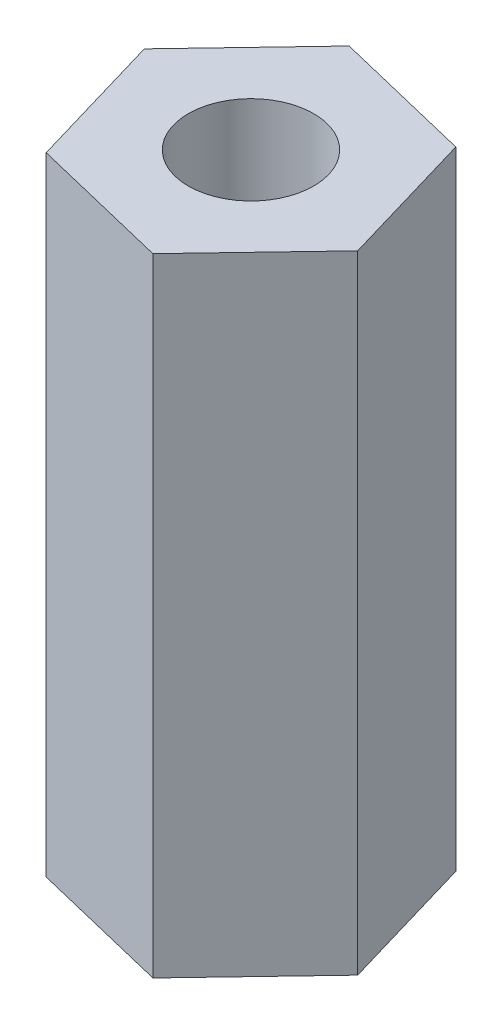
ISO-10303-21;
HEADER;
FILE_DESCRIPTION(('STEP AP214'),'2;1');
FILE_NAME('part.step','',(''),(''),'','','');
FILE_SCHEMA(('AUTOMOTIVE_DESIGN { 1 0 10303 214 1 1 1 1 }'));
ENDSEC;
DATA;
#1=APPLICATION_CONTEXT('core data for automotive mechanical design processes');
#2=APPLICATION_PROTOCOL_DEFINITION('international standard','automotive_design',2000,#1);
#3=PRODUCT_CONTEXT('',#1,'mechanical');
#4=PRODUCT('Part','Part','',(#3));
#5=PRODUCT_RELATED_PRODUCT_CATEGORY('part','',(#4));
#6=PRODUCT_DEFINITION_FORMATION('','',#4);
#7=PRODUCT_DEFINITION_CONTEXT('part definition',#1,'design');
#8=PRODUCT_DEFINITION('design','',#6,#7);
#9=PRODUCT_DEFINITION_SHAPE('','',#8);
#10=(LENGTH_UNIT() NAMED_UNIT(*) SI_UNIT(.MILLI.,.METRE.));
#11=(NAMED_UNIT(*) PLANE_ANGLE_UNIT() SI_UNIT($,.RADIAN.));
#12=(NAMED_UNIT(*) SI_UNIT($,.STERADIAN.) SOLID_ANGLE_UNIT());
#13=UNCERTAINTY_MEASURE_WITH_UNIT(LENGTH_MEASURE(1.E-05),#10,'distance_accuracy_value','');
#14=(GEOMETRIC_REPRESENTATION_CONTEXT(3) GLOBAL_UNCERTAINTY_ASSIGNED_CONTEXT((#13)) GLOBAL_UNIT_ASSIGNED_CONTEXT((#10,
#11,#12)) REPRESENTATION_CONTEXT('',''));
#15=CARTESIAN_POINT('',(0.,0.,0.));
#16=DIRECTION('',(0.,0.,1.));
#17=DIRECTION('',(1.,0.,0.));
#18=AXIS2_PLACEMENT_3D('',#15,#16,#17);
#19=CARTESIAN_POINT('',(0.,7.5,0.));
#20=DIRECTION('',(0.,1.,0.));
#21=DIRECTION('',(0.,0.,1.));
#22=AXIS2_PLACEMENT_3D('',#19,#20,#21);
#23=PLANE('',#22);
#24=DIRECTION('',(0.971906320154711,0.,0.235368020009788));
#25=VECTOR('',#24,1.);
#26=CARTESIAN_POINT('',(-2.38949518673463,7.5,2.50804959133029));
#27=LINE('',#26,#25);
#28=CARTESIAN_POINT('',(-2.38949518673463,7.5,2.50804959133029));
#29=VERTEX_POINT('',#28);
#30=CARTESIAN_POINT('',(0.9772870666759,7.5,3.32338832959798));
#31=VERTEX_POINT('',#30);
#32=EDGE_CURVE('E146',#29,#31,#27,.T.);
#33=ORIENTED_EDGE('',*,*,#32,.T.);
#34=DIRECTION('',(0.689787844644276,0.,-0.724011553347738));
#35=VECTOR('',#34,1.);
#36=CARTESIAN_POINT('',(0.9772870666759,7.5,3.32338832959798));
#37=LINE('',#36,#35);
#38=CARTESIAN_POINT('',(3.36678225341053,7.5,0.815338738267681));
#39=VERTEX_POINT('',#38);
#40=EDGE_CURVE('E94',#31,#39,#37,.T.);
#41=ORIENTED_EDGE('',*,*,#40,.T.);
#42=DIRECTION('',(-0.282118475510435,0.,-0.959379573357526));
#43=VECTOR('',#42,1.);
#44=CARTESIAN_POINT('',(3.36678225341053,7.5,0.815338738267681));
#45=LINE('',#44,#43);
#46=CARTESIAN_POINT('',(2.38949518673463,7.5,-2.50804959133029));
#47=VERTEX_POINT('',#46);
#48=EDGE_CURVE('E107',#39,#47,#45,.T.);
#49=ORIENTED_EDGE('',*,*,#48,.T.);
#50=DIRECTION('',(-0.971906320154711,0.,-0.235368020009788));
#51=VECTOR('',#50,1.);
#52=CARTESIAN_POINT('',(2.38949518673463,7.5,-2.50804959133029));
#53=LINE('',#52,#51);
#54=CARTESIAN_POINT('',(-0.977287066675899,7.5,-3.32338832959798));
#55=VERTEX_POINT('',#54);
#56=EDGE_CURVE('E101',#47,#55,#53,.T.);
#57=ORIENTED_EDGE('',*,*,#56,.T.);
#58=DIRECTION('',(-0.689787844644276,0.,0.724011553347738));
#59=VECTOR('',#58,1.);
#60=CARTESIAN_POINT('',(-0.977287066675899,7.5,-3.32338832959798));
#61=LINE('',#60,#59);
#62=CARTESIAN_POINT('',(-3.36678225341053,7.5,-0.815338738267681));
#63=VERTEX_POINT('',#62);
#64=EDGE_CURVE('E105',#55,#63,#61,.T.);
#65=ORIENTED_EDGE('',*,*,#64,.T.);
#66=DIRECTION('',(0.282118475510435,0.,0.959379573357526));
#67=VECTOR('',#66,1.);
#68=CARTESIAN_POINT('',(-3.36678225341053,7.5,-0.815338738267681));
#69=LINE('',#68,#67);
#70=EDGE_CURVE('E57',#63,#29,#69,.T.);
#71=ORIENTED_EDGE('',*,*,#70,.T.);
#72=EDGE_LOOP('',(#33,#41,#49,#57,#65,#71));
#73=FACE_BOUND('',#72,.T.);
#74=CARTESIAN_POINT('',(0.,7.5,0.));
#75=DIRECTION('',(0.,1.,0.));
#76=DIRECTION('',(0.,0.,1.));
#77=AXIS2_PLACEMENT_3D('',#74,#75,#76);
#78=CIRCLE('',#77,1.5);
#79=CARTESIAN_POINT('',(0.,7.5,1.5));
#80=VERTEX_POINT('',#79);
#81=EDGE_CURVE('E134',#80,#80,#78,.T.);
#82=ORIENTED_EDGE('',*,*,#81,.F.);
#83=EDGE_LOOP('',(#82));
#84=FACE_BOUND('',#83,.T.);
#85=ADVANCED_FACE('F39',(#73,#84),#23,.T.);
#86=CARTESIAN_POINT('',(0.,-7.5,0.));
#87=DIRECTION('',(0.,1.,0.));
#88=DIRECTION('',(0.,0.,1.));
#89=AXIS2_PLACEMENT_3D('',#86,#87,#88);
#90=PLANE('',#89);
#91=DIRECTION('',(0.971906320154711,0.,0.235368020009788));
#92=VECTOR('',#91,1.);
#93=CARTESIAN_POINT('',(-2.38949518673463,-7.5,2.50804959133029));
#94=LINE('',#93,#92);
#95=CARTESIAN_POINT('',(-2.38949518673463,-7.5,2.50804959133029));
#96=VERTEX_POINT('',#95);
#97=CARTESIAN_POINT('',(0.9772870666759,-7.5,3.32338832959798));
#98=VERTEX_POINT('',#97);
#99=EDGE_CURVE('E129',#96,#98,#94,.T.);
#100=ORIENTED_EDGE('',*,*,#99,.F.);
#101=DIRECTION('',(0.282118475510435,0.,0.959379573357526));
#102=VECTOR('',#101,1.);
#103=CARTESIAN_POINT('',(-3.36678225341053,-7.5,-0.815338738267681));
#104=LINE('',#103,#102);
#105=CARTESIAN_POINT('',(-3.36678225341053,-7.5,-0.815338738267681));
#106=VERTEX_POINT('',#105);
#107=EDGE_CURVE('E86',#106,#96,#104,.T.);
#108=ORIENTED_EDGE('',*,*,#107,.F.);
#109=DIRECTION('',(-0.689787844644276,0.,0.724011553347738));
#110=VECTOR('',#109,1.);
#111=CARTESIAN_POINT('',(-0.977287066675899,-7.5,-3.32338832959798));
#112=LINE('',#111,#110);
#113=CARTESIAN_POINT('',(-0.977287066675899,-7.5,-3.32338832959798));
#114=VERTEX_POINT('',#113);
#115=EDGE_CURVE('E80',#114,#106,#112,.T.);
#116=ORIENTED_EDGE('',*,*,#115,.F.);
#117=DIRECTION('',(-0.971906320154711,0.,-0.235368020009788));
#118=VECTOR('',#117,1.);
#119=CARTESIAN_POINT('',(2.38949518673463,-7.5,-2.50804959133029));
#120=LINE('',#119,#118);
#121=CARTESIAN_POINT('',(2.38949518673463,-7.5,-2.50804959133029));
#122=VERTEX_POINT('',#121);
#123=EDGE_CURVE('E116',#122,#114,#120,.T.);
#124=ORIENTED_EDGE('',*,*,#123,.F.);
#125=DIRECTION('',(-0.282118475510435,0.,-0.959379573357526));
#126=VECTOR('',#125,1.);
#127=CARTESIAN_POINT('',(3.36678225341053,-7.5,0.815338738267681));
#128=LINE('',#127,#126);
#129=CARTESIAN_POINT('',(3.36678225341053,-7.5,0.815338738267681));
#130=VERTEX_POINT('',#129);
#131=EDGE_CURVE('E137',#130,#122,#128,.T.);
#132=ORIENTED_EDGE('',*,*,#131,.F.);
#133=DIRECTION('',(0.689787844644276,0.,-0.724011553347738));
#134=VECTOR('',#133,1.);
#135=CARTESIAN_POINT('',(0.9772870666759,-7.5,3.32338832959798));
#136=LINE('',#135,#134);
#137=EDGE_CURVE('E133',#98,#130,#136,.T.);
#138=ORIENTED_EDGE('',*,*,#137,.F.);
#139=EDGE_LOOP('',(#100,#108,#116,#124,#132,#138));
#140=FACE_BOUND('',#139,.T.);
#141=CARTESIAN_POINT('',(0.,-7.5,0.));
#142=DIRECTION('',(0.,1.,0.));
#143=DIRECTION('',(0.,0.,1.));
#144=AXIS2_PLACEMENT_3D('',#141,#142,#143);
#145=CIRCLE('',#144,1.5);
#146=CARTESIAN_POINT('',(0.,-7.5,1.5));
#147=VERTEX_POINT('',#146);
#148=EDGE_CURVE('E243',#147,#147,#145,.T.);
#149=ORIENTED_EDGE('',*,*,#148,.T.);
#150=EDGE_LOOP('',(#149));
#151=FACE_BOUND('',#150,.T.);
#152=ADVANCED_FACE('F159',(#140,#151),#90,.F.);
#153=CARTESIAN_POINT('',(-2.38949518673463,7.5,2.50804959133029));
#154=DIRECTION('',(0.235368020009788,0.,-0.971906320154711));
#155=DIRECTION('',(-0.971906320154711,0.,-0.235368020009788));
#156=AXIS2_PLACEMENT_3D('',#153,#154,#155);
#157=PLANE('',#156);
#158=ORIENTED_EDGE('',*,*,#99,.T.);
#159=DIRECTION('',(0.,-1.,0.));
#160=VECTOR('',#159,1.);
#161=CARTESIAN_POINT('',(0.9772870666759,7.5,3.32338832959798));
#162=LINE('',#161,#160);
#163=EDGE_CURVE('E11',#31,#98,#162,.T.);
#164=ORIENTED_EDGE('',*,*,#163,.F.);
#165=ORIENTED_EDGE('',*,*,#32,.F.);
#166=DIRECTION('',(0.,-1.,0.));
#167=VECTOR('',#166,1.);
#168=CARTESIAN_POINT('',(-2.38949518673463,7.5,2.50804959133029));
#169=LINE('',#168,#167);
#170=EDGE_CURVE('E125',#29,#96,#169,.T.);
#171=ORIENTED_EDGE('',*,*,#170,.T.);
#172=EDGE_LOOP('',(#158,#164,#165,#171));
#173=FACE_BOUND('',#172,.T.);
#174=ADVANCED_FACE('F41',(#173),#157,.F.);
#175=CARTESIAN_POINT('',(0.9772870666759,7.5,3.32338832959798));
#176=DIRECTION('',(-0.724011553347738,0.,-0.689787844644276));
#177=DIRECTION('',(-0.689787844644276,0.,0.724011553347738));
#178=AXIS2_PLACEMENT_3D('',#175,#176,#177);
#179=PLANE('',#178);
#180=ORIENTED_EDGE('',*,*,#137,.T.);
#181=DIRECTION('',(0.,-1.,0.));
#182=VECTOR('',#181,1.);
#183=CARTESIAN_POINT('',(3.36678225341053,7.5,0.815338738267681));
#184=LINE('',#183,#182);
#185=EDGE_CURVE('E49',#39,#130,#184,.T.);
#186=ORIENTED_EDGE('',*,*,#185,.F.);
#187=ORIENTED_EDGE('',*,*,#40,.F.);
#188=ORIENTED_EDGE('',*,*,#163,.T.);
#189=EDGE_LOOP('',(#180,#186,#187,#188));
#190=FACE_BOUND('',#189,.T.);
#191=ADVANCED_FACE('F184',(#190),#179,.F.);
#192=CARTESIAN_POINT('',(3.36678225341053,7.5,0.815338738267681));
#193=DIRECTION('',(-0.959379573357526,0.,0.282118475510435));
#194=DIRECTION('',(0.282118475510435,0.,0.959379573357526));
#195=AXIS2_PLACEMENT_3D('',#192,#193,#194);
#196=PLANE('',#195);
#197=ORIENTED_EDGE('',*,*,#131,.T.);
#198=DIRECTION('',(0.,-1.,0.));
#199=VECTOR('',#198,1.);
#200=CARTESIAN_POINT('',(2.38949518673463,7.5,-2.50804959133029));
#201=LINE('',#200,#199);
#202=EDGE_CURVE('E118',#47,#122,#201,.T.);
#203=ORIENTED_EDGE('',*,*,#202,.F.);
#204=ORIENTED_EDGE('',*,*,#48,.F.);
#205=ORIENTED_EDGE('',*,*,#185,.T.);
#206=EDGE_LOOP('',(#197,#203,#204,#205));
#207=FACE_BOUND('',#206,.T.);
#208=ADVANCED_FACE('F156',(#207),#196,.F.);
#209=CARTESIAN_POINT('',(2.38949518673463,7.5,-2.50804959133029));
#210=DIRECTION('',(-0.235368020009788,0.,0.971906320154711));
#211=DIRECTION('',(0.971906320154711,0.,0.235368020009788));
#212=AXIS2_PLACEMENT_3D('',#209,#210,#211);
#213=PLANE('',#212);
#214=ORIENTED_EDGE('',*,*,#123,.T.);
#215=DIRECTION('',(0.,-1.,0.));
#216=VECTOR('',#215,1.);
#217=CARTESIAN_POINT('',(-0.977287066675899,7.5,-3.32338832959798));
#218=LINE('',#217,#216);
#219=EDGE_CURVE('E113',#55,#114,#218,.T.);
#220=ORIENTED_EDGE('',*,*,#219,.F.);
#221=ORIENTED_EDGE('',*,*,#56,.F.);
#222=ORIENTED_EDGE('',*,*,#202,.T.);
#223=EDGE_LOOP('',(#214,#220,#221,#222));
#224=FACE_BOUND('',#223,.T.);
#225=ADVANCED_FACE('F114',(#224),#213,.F.);
#226=CARTESIAN_POINT('',(-0.977287066675899,7.5,-3.32338832959798));
#227=DIRECTION('',(0.724011553347738,0.,0.689787844644276));
#228=DIRECTION('',(0.689787844644276,0.,-0.724011553347738));
#229=AXIS2_PLACEMENT_3D('',#226,#227,#228);
#230=PLANE('',#229);
#231=ORIENTED_EDGE('',*,*,#115,.T.);
#232=DIRECTION('',(0.,-1.,0.));
#233=VECTOR('',#232,1.);
#234=CARTESIAN_POINT('',(-3.36678225341053,7.5,-0.815338738267681));
#235=LINE('',#234,#233);
#236=EDGE_CURVE('E119',#63,#106,#235,.T.);
#237=ORIENTED_EDGE('',*,*,#236,.F.);
#238=ORIENTED_EDGE('',*,*,#64,.F.);
#239=ORIENTED_EDGE('',*,*,#219,.T.);
#240=EDGE_LOOP('',(#231,#237,#238,#239));
#241=FACE_BOUND('',#240,.T.);
#242=ADVANCED_FACE('F121',(#241),#230,.F.);
#243=CARTESIAN_POINT('',(-3.36678225341053,7.5,-0.815338738267681));
#244=DIRECTION('',(0.959379573357526,0.,-0.282118475510435));
#245=DIRECTION('',(-0.282118475510435,0.,-0.959379573357526));
#246=AXIS2_PLACEMENT_3D('',#243,#244,#245);
#247=PLANE('',#246);
#248=ORIENTED_EDGE('',*,*,#107,.T.);
#249=ORIENTED_EDGE('',*,*,#170,.F.);
#250=ORIENTED_EDGE('',*,*,#70,.F.);
#251=ORIENTED_EDGE('',*,*,#236,.T.);
#252=EDGE_LOOP('',(#248,#249,#250,#251));
#253=FACE_BOUND('',#252,.T.);
#254=ADVANCED_FACE('F164',(#253),#247,.F.);
#255=CARTESIAN_POINT('',(0.,7.5,0.));
#256=DIRECTION('',(0.,-1.,0.));
#257=DIRECTION('',(0.,0.,-1.));
#258=AXIS2_PLACEMENT_3D('',#255,#256,#257);
#259=CYLINDRICAL_SURFACE('',#258,1.5);
#260=ORIENTED_EDGE('',*,*,#81,.T.);
#261=EDGE_LOOP('',(#260));
#262=FACE_BOUND('',#261,.T.);
#263=ORIENTED_EDGE('',*,*,#148,.F.);
#264=EDGE_LOOP('',(#263));
#265=FACE_BOUND('',#264,.T.);
#266=ADVANCED_FACE('F166',(#262,#265),#259,.F.);
#267=CLOSED_SHELL('',(#85,#152,#174,#191,#208,#225,#242,#254,#266));
#268=MANIFOLD_SOLID_BREP('B2',#267);
#269=ADVANCED_BREP_SHAPE_REPRESENTATION('',(#18,#268),#14);
#270=SHAPE_DEFINITION_REPRESENTATION(#9,#269);
ENDSEC;
END-ISO-10303-21;
